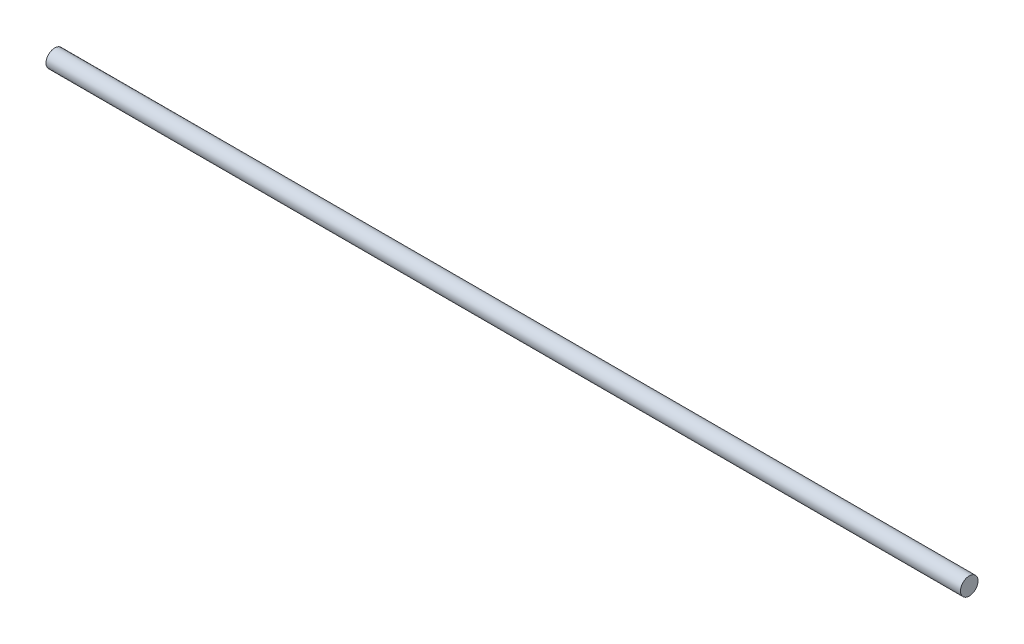
ISO-10303-21;
HEADER;
FILE_DESCRIPTION(('STEP AP214'),'2;1');
FILE_NAME('part.step','',(''),(''),'','','');
FILE_SCHEMA(('AUTOMOTIVE_DESIGN { 1 0 10303 214 1 1 1 1 }'));
ENDSEC;
DATA;
#1=APPLICATION_CONTEXT('core data for automotive mechanical design processes');
#2=APPLICATION_PROTOCOL_DEFINITION('international standard','automotive_design',2000,#1);
#3=PRODUCT_CONTEXT('',#1,'mechanical');
#4=PRODUCT('Part','Part','',(#3));
#5=PRODUCT_RELATED_PRODUCT_CATEGORY('part','',(#4));
#6=PRODUCT_DEFINITION_FORMATION('','',#4);
#7=PRODUCT_DEFINITION_CONTEXT('part definition',#1,'design');
#8=PRODUCT_DEFINITION('design','',#6,#7);
#9=PRODUCT_DEFINITION_SHAPE('','',#8);
#10=(LENGTH_UNIT() NAMED_UNIT(*) SI_UNIT(.MILLI.,.METRE.));
#11=(NAMED_UNIT(*) PLANE_ANGLE_UNIT() SI_UNIT($,.RADIAN.));
#12=(NAMED_UNIT(*) SI_UNIT($,.STERADIAN.) SOLID_ANGLE_UNIT());
#13=UNCERTAINTY_MEASURE_WITH_UNIT(LENGTH_MEASURE(1.E-05),#10,'distance_accuracy_value','');
#14=(GEOMETRIC_REPRESENTATION_CONTEXT(3) GLOBAL_UNCERTAINTY_ASSIGNED_CONTEXT((#13)) GLOBAL_UNIT_ASSIGNED_CONTEXT((#10,
#11,#12)) REPRESENTATION_CONTEXT('',''));
#15=CARTESIAN_POINT('',(0.,0.,0.));
#16=DIRECTION('',(0.,0.,1.));
#17=DIRECTION('',(1.,0.,0.));
#18=AXIS2_PLACEMENT_3D('',#15,#16,#17);
#19=CARTESIAN_POINT('',(156.49,0.,0.));
#20=DIRECTION('',(-1.,0.,0.));
#21=DIRECTION('',(0.,0.,1.));
#22=AXIS2_PLACEMENT_3D('',#19,#20,#21);
#23=CYLINDRICAL_SURFACE('',#22,1.5);
#24=CARTESIAN_POINT('',(156.49,0.,0.));
#25=DIRECTION('',(1.,0.,0.));
#26=DIRECTION('',(0.,0.,-1.));
#27=AXIS2_PLACEMENT_3D('',#24,#25,#26);
#28=CIRCLE('',#27,1.5);
#29=CARTESIAN_POINT('',(156.49,0.,1.5));
#30=VERTEX_POINT('',#29);
#31=EDGE_CURVE('E10',#30,#30,#28,.T.);
#32=CARTESIAN_POINT('',(0.,0.,0.));
#33=DIRECTION('',(1.,0.,0.));
#34=DIRECTION('',(0.,0.,-1.));
#35=AXIS2_PLACEMENT_3D('',#32,#33,#34);
#36=CIRCLE('',#35,1.5);
#37=CARTESIAN_POINT('',(0.,0.,1.5));
#38=VERTEX_POINT('',#37);
#39=EDGE_CURVE('E34',#38,#38,#36,.T.);
#40=CARTESIAN_POINT('',(156.49,0.,1.5));
#41=CARTESIAN_POINT('',(154.859895833333,0.,1.5));
#42=CARTESIAN_POINT('',(153.229791666667,0.,1.5));
#43=CARTESIAN_POINT('',(149.969583333333,0.,1.5));
#44=CARTESIAN_POINT('',(148.339479166667,0.,1.5));
#45=CARTESIAN_POINT('',(145.079270833333,0.,1.5));
#46=CARTESIAN_POINT('',(143.449166666667,0.,1.5));
#47=CARTESIAN_POINT('',(140.188958333333,0.,1.5));
#48=CARTESIAN_POINT('',(138.558854166667,0.,1.5));
#49=CARTESIAN_POINT('',(135.298645833333,0.,1.5));
#50=CARTESIAN_POINT('',(133.668541666667,0.,1.5));
#51=CARTESIAN_POINT('',(130.408333333333,0.,1.5));
#52=CARTESIAN_POINT('',(128.778229166667,0.,1.5));
#53=CARTESIAN_POINT('',(125.518020833333,0.,1.5));
#54=CARTESIAN_POINT('',(123.887916666667,0.,1.5));
#55=CARTESIAN_POINT('',(120.627708333333,0.,1.5));
#56=CARTESIAN_POINT('',(118.997604166667,0.,1.5));
#57=CARTESIAN_POINT('',(115.737395833333,0.,1.5));
#58=CARTESIAN_POINT('',(114.107291666667,0.,1.5));
#59=CARTESIAN_POINT('',(110.847083333333,0.,1.5));
#60=CARTESIAN_POINT('',(109.216979166667,0.,1.5));
#61=CARTESIAN_POINT('',(105.956770833333,0.,1.5));
#62=CARTESIAN_POINT('',(104.326666666667,0.,1.5));
#63=CARTESIAN_POINT('',(101.066458333333,0.,1.5));
#64=CARTESIAN_POINT('',(99.4363541666667,0.,1.5));
#65=CARTESIAN_POINT('',(96.1761458333333,0.,1.5));
#66=CARTESIAN_POINT('',(94.5460416666667,0.,1.5));
#67=CARTESIAN_POINT('',(91.2858333333333,0.,1.5));
#68=CARTESIAN_POINT('',(89.6557291666667,0.,1.5));
#69=CARTESIAN_POINT('',(86.3955208333333,0.,1.5));
#70=CARTESIAN_POINT('',(84.7654166666667,0.,1.5));
#71=CARTESIAN_POINT('',(81.5052083333333,0.,1.5));
#72=CARTESIAN_POINT('',(79.8751041666667,0.,1.5));
#73=CARTESIAN_POINT('',(76.6148958333333,0.,1.5));
#74=CARTESIAN_POINT('',(74.9847916666667,0.,1.5));
#75=CARTESIAN_POINT('',(71.7245833333333,0.,1.5));
#76=CARTESIAN_POINT('',(70.0944791666667,0.,1.5));
#77=CARTESIAN_POINT('',(66.8342708333333,0.,1.5));
#78=CARTESIAN_POINT('',(65.2041666666667,0.,1.5));
#79=CARTESIAN_POINT('',(61.9439583333333,0.,1.5));
#80=CARTESIAN_POINT('',(60.3138541666667,0.,1.5));
#81=CARTESIAN_POINT('',(57.0536458333333,0.,1.5));
#82=CARTESIAN_POINT('',(55.4235416666667,0.,1.5));
#83=CARTESIAN_POINT('',(52.1633333333333,0.,1.5));
#84=CARTESIAN_POINT('',(50.5332291666667,0.,1.5));
#85=CARTESIAN_POINT('',(47.2730208333333,0.,1.5));
#86=CARTESIAN_POINT('',(45.6429166666667,0.,1.5));
#87=CARTESIAN_POINT('',(42.3827083333333,0.,1.5));
#88=CARTESIAN_POINT('',(40.7526041666666,0.,1.5));
#89=CARTESIAN_POINT('',(37.4923958333333,0.,1.5));
#90=CARTESIAN_POINT('',(35.8622916666666,0.,1.5));
#91=CARTESIAN_POINT('',(32.6020833333333,0.,1.5));
#92=CARTESIAN_POINT('',(30.9719791666667,0.,1.5));
#93=CARTESIAN_POINT('',(27.7117708333333,0.,1.5));
#94=CARTESIAN_POINT('',(26.0816666666666,0.,1.5));
#95=CARTESIAN_POINT('',(22.8214583333333,0.,1.5));
#96=CARTESIAN_POINT('',(21.1913541666666,0.,1.5));
#97=CARTESIAN_POINT('',(17.9311458333333,0.,1.5));
#98=CARTESIAN_POINT('',(16.3010416666666,0.,1.5));
#99=CARTESIAN_POINT('',(13.0408333333333,0.,1.5));
#100=CARTESIAN_POINT('',(11.4107291666667,0.,1.5));
#101=CARTESIAN_POINT('',(8.15052083333331,0.,1.5));
#102=CARTESIAN_POINT('',(6.52041666666664,0.,1.5));
#103=CARTESIAN_POINT('',(3.2602083333333,0.,1.5));
#104=CARTESIAN_POINT('',(1.63010416666664,0.,1.5));
#105=CARTESIAN_POINT('',(0.,0.,1.5));
#106=B_SPLINE_CURVE_WITH_KNOTS('',3,(#40,#41,#42,#43,#44,#45,#46,#47,#48,#49,#50,#51,#52,#53,
#54,#55,#56,#57,#58,#59,#60,#61,#62,#63,#64,#65,#66,#67,#68,#69,#70,#71,#72,#73,#74,#75,#76,#77,
#78,#79,#80,#81,#82,#83,#84,#85,#86,#87,#88,#89,#90,#91,#92,#93,#94,#95,#96,#97,#98,#99,#100,
#101,#102,#103,#104,#105),.UNSPECIFIED.,.F.,.F.,(4,2,2,2,2,2,2,2,2,2,2,2,2,2,2,2,2,2,2,2,2,2,2,
2,2,2,2,2,2,2,2,2,4),(0.,4.89031249999999,9.78062499999999,14.6709375,19.56125,24.4515625,
29.341875,34.2321875,39.1225,44.0128125,48.903125,53.7934375,58.68375,63.5740625,68.464375,
73.3546875,78.245,83.1353125,88.025625,92.9159375,97.80625,102.6965625,107.586875,112.4771875,
117.3675,122.2578125,127.148125,132.0384375,136.92875,141.8190625,146.709375,151.5996875,
156.49),.UNSPECIFIED.);
#107=EDGE_CURVE('BSEAM31',#30,#38,#106,.T.);
#108=ORIENTED_EDGE('',*,*,#31,.F.);
#109=ORIENTED_EDGE('',*,*,#39,.T.);
#110=ORIENTED_EDGE('',*,*,#107,.T.);
#111=ORIENTED_EDGE('',*,*,#107,.F.);
#112=EDGE_LOOP('',(#108,#110,#109,#111));
#113=FACE_BOUND('',#112,.T.);
#114=ADVANCED_FACE('F31',(#113),#23,.T.);
#115=CARTESIAN_POINT('',(156.49,0.,0.));
#116=DIRECTION('',(1.,0.,0.));
#117=DIRECTION('',(0.,0.,-1.));
#118=AXIS2_PLACEMENT_3D('',#115,#116,#117);
#119=PLANE('',#118);
#120=ORIENTED_EDGE('',*,*,#31,.T.);
#121=EDGE_LOOP('',(#120));
#122=FACE_BOUND('',#121,.T.);
#123=ADVANCED_FACE('F46',(#122),#119,.T.);
#124=CARTESIAN_POINT('',(0.,0.,0.));
#125=DIRECTION('',(1.,0.,0.));
#126=DIRECTION('',(0.,0.,-1.));
#127=AXIS2_PLACEMENT_3D('',#124,#125,#126);
#128=PLANE('',#127);
#129=ORIENTED_EDGE('',*,*,#39,.F.);
#130=EDGE_LOOP('',(#129));
#131=FACE_BOUND('',#130,.T.);
#132=ADVANCED_FACE('F44',(#131),#128,.F.);
#133=CLOSED_SHELL('',(#114,#123,#132));
#134=MANIFOLD_SOLID_BREP('B2',#133);
#135=ADVANCED_BREP_SHAPE_REPRESENTATION('',(#18,#134),#14);
#136=SHAPE_DEFINITION_REPRESENTATION(#9,#135);
ENDSEC;
END-ISO-10303-21;
